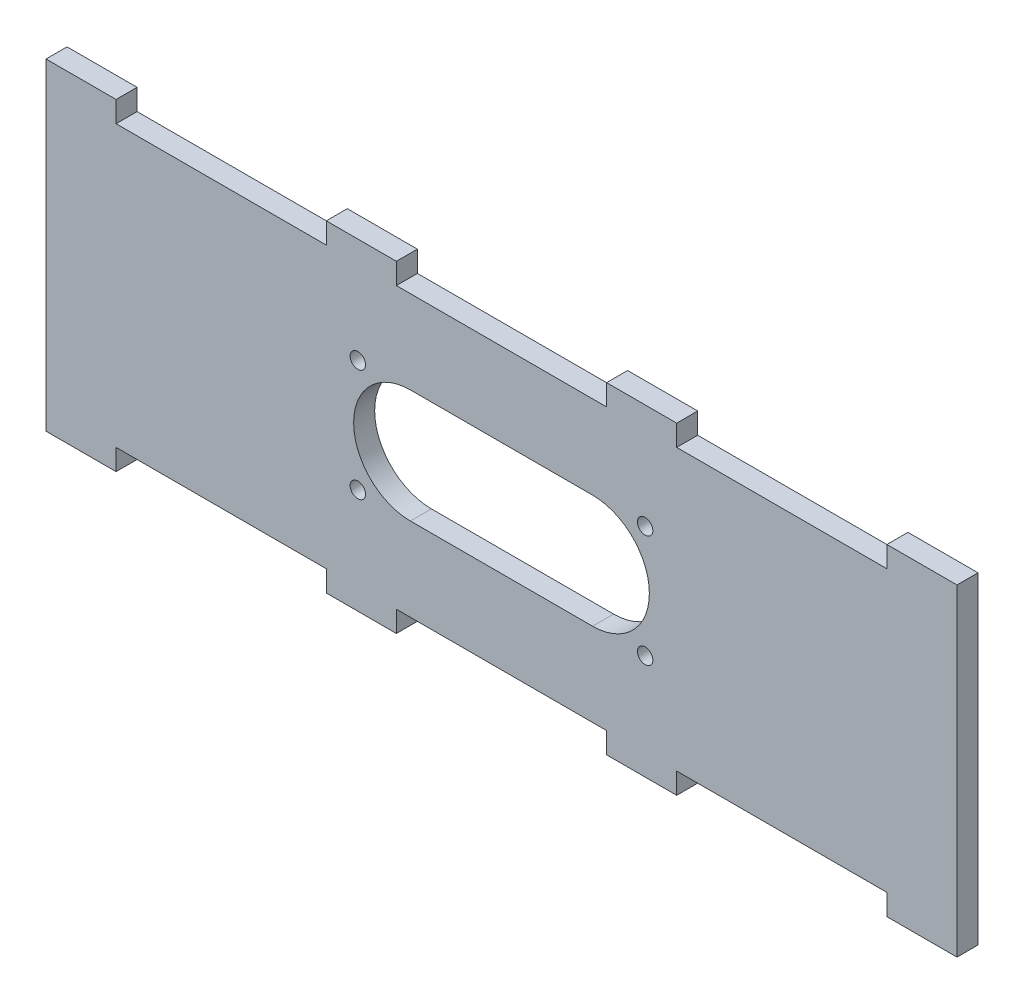
ISO-10303-21;
HEADER;
FILE_DESCRIPTION(('STEP AP214'),'2;1');
FILE_NAME('part.step','',(''),(''),'','','');
FILE_SCHEMA(('AUTOMOTIVE_DESIGN { 1 0 10303 214 1 1 1 1 }'));
ENDSEC;
DATA;
#1=APPLICATION_CONTEXT('core data for automotive mechanical design processes');
#2=APPLICATION_PROTOCOL_DEFINITION('international standard','automotive_design',2000,#1);
#3=PRODUCT_CONTEXT('',#1,'mechanical');
#4=PRODUCT('Part','Part','',(#3));
#5=PRODUCT_RELATED_PRODUCT_CATEGORY('part','',(#4));
#6=PRODUCT_DEFINITION_FORMATION('','',#4);
#7=PRODUCT_DEFINITION_CONTEXT('part definition',#1,'design');
#8=PRODUCT_DEFINITION('design','',#6,#7);
#9=PRODUCT_DEFINITION_SHAPE('','',#8);
#10=(LENGTH_UNIT() NAMED_UNIT(*) SI_UNIT(.MILLI.,.METRE.));
#11=(NAMED_UNIT(*) PLANE_ANGLE_UNIT() SI_UNIT($,.RADIAN.));
#12=(NAMED_UNIT(*) SI_UNIT($,.STERADIAN.) SOLID_ANGLE_UNIT());
#13=UNCERTAINTY_MEASURE_WITH_UNIT(LENGTH_MEASURE(1.E-05),#10,'distance_accuracy_value','');
#14=(GEOMETRIC_REPRESENTATION_CONTEXT(3) GLOBAL_UNCERTAINTY_ASSIGNED_CONTEXT((#13)) GLOBAL_UNIT_ASSIGNED_CONTEXT((#10,
#11,#12)) REPRESENTATION_CONTEXT('',''));
#15=CARTESIAN_POINT('',(0.,0.,0.));
#16=DIRECTION('',(0.,0.,1.));
#17=DIRECTION('',(1.,0.,0.));
#18=AXIS2_PLACEMENT_3D('',#15,#16,#17);
#19=CARTESIAN_POINT('',(-65.,0.,3.));
#20=DIRECTION('',(1.,0.,0.));
#21=DIRECTION('',(0.,0.,-1.));
#22=AXIS2_PLACEMENT_3D('',#19,#20,#21);
#23=PLANE('',#22);
#24=DIRECTION('',(0.,-1.,0.));
#25=VECTOR('',#24,1.);
#26=CARTESIAN_POINT('',(-65.,0.,0.));
#27=LINE('',#26,#25);
#28=CARTESIAN_POINT('',(-65.,23.,0.));
#29=VERTEX_POINT('',#28);
#30=CARTESIAN_POINT('',(-65.,-23.,0.));
#31=VERTEX_POINT('',#30);
#32=EDGE_CURVE('E305',#29,#31,#27,.T.);
#33=ORIENTED_EDGE('',*,*,#32,.T.);
#34=DIRECTION('',(0.,0.,-1.));
#35=VECTOR('',#34,1.);
#36=CARTESIAN_POINT('',(-65.,-23.,3.));
#37=LINE('',#36,#35);
#38=CARTESIAN_POINT('',(-65.,-23.,3.));
#39=VERTEX_POINT('',#38);
#40=EDGE_CURVE('E11',#39,#31,#37,.T.);
#41=ORIENTED_EDGE('',*,*,#40,.F.);
#42=DIRECTION('',(0.,-1.,0.));
#43=VECTOR('',#42,1.);
#44=CARTESIAN_POINT('',(-65.,0.,3.));
#45=LINE('',#44,#43);
#46=CARTESIAN_POINT('',(-65.,23.,3.));
#47=VERTEX_POINT('',#46);
#48=EDGE_CURVE('E309',#47,#39,#45,.T.);
#49=ORIENTED_EDGE('',*,*,#48,.F.);
#50=DIRECTION('',(0.,0.,-1.));
#51=VECTOR('',#50,1.);
#52=CARTESIAN_POINT('',(-65.,23.,3.));
#53=LINE('',#52,#51);
#54=EDGE_CURVE('E399',#47,#29,#53,.T.);
#55=ORIENTED_EDGE('',*,*,#54,.T.);
#56=EDGE_LOOP('',(#33,#41,#49,#55));
#57=FACE_BOUND('',#56,.T.);
#58=ADVANCED_FACE('F39',(#57),#23,.F.);
#59=CARTESIAN_POINT('',(0.,-23.,3.));
#60=DIRECTION('',(0.,1.,0.));
#61=DIRECTION('',(-1.,0.,0.));
#62=AXIS2_PLACEMENT_3D('',#59,#60,#61);
#63=PLANE('',#62);
#64=DIRECTION('',(1.,0.,0.));
#65=VECTOR('',#64,1.);
#66=CARTESIAN_POINT('',(0.,-23.,0.));
#67=LINE('',#66,#65);
#68=CARTESIAN_POINT('',(-55.,-23.,0.));
#69=VERTEX_POINT('',#68);
#70=EDGE_CURVE('E403',#31,#69,#67,.T.);
#71=ORIENTED_EDGE('',*,*,#70,.T.);
#72=DIRECTION('',(0.,0.,-1.));
#73=VECTOR('',#72,1.);
#74=CARTESIAN_POINT('',(-55.,-23.,3.));
#75=LINE('',#74,#73);
#76=CARTESIAN_POINT('',(-55.,-23.,3.));
#77=VERTEX_POINT('',#76);
#78=EDGE_CURVE('E47',#77,#69,#75,.T.);
#79=ORIENTED_EDGE('',*,*,#78,.F.);
#80=DIRECTION('',(1.,0.,0.));
#81=VECTOR('',#80,1.);
#82=CARTESIAN_POINT('',(0.,-23.,3.));
#83=LINE('',#82,#81);
#84=EDGE_CURVE('E313',#39,#77,#83,.T.);
#85=ORIENTED_EDGE('',*,*,#84,.F.);
#86=ORIENTED_EDGE('',*,*,#40,.T.);
#87=EDGE_LOOP('',(#71,#79,#85,#86));
#88=FACE_BOUND('',#87,.T.);
#89=ADVANCED_FACE('F583',(#88),#63,.F.);
#90=CARTESIAN_POINT('',(-55.,0.,3.));
#91=DIRECTION('',(1.,0.,0.));
#92=DIRECTION('',(0.,0.,-1.));
#93=AXIS2_PLACEMENT_3D('',#90,#91,#92);
#94=PLANE('',#93);
#95=DIRECTION('',(0.,-1.,0.));
#96=VECTOR('',#95,1.);
#97=CARTESIAN_POINT('',(-55.,0.,0.));
#98=LINE('',#97,#96);
#99=CARTESIAN_POINT('',(-55.,-20.,0.));
#100=VERTEX_POINT('',#99);
#101=EDGE_CURVE('E407',#100,#69,#98,.T.);
#102=ORIENTED_EDGE('',*,*,#101,.F.);
#103=DIRECTION('',(0.,0.,-1.));
#104=VECTOR('',#103,1.);
#105=CARTESIAN_POINT('',(-55.,-20.,3.));
#106=LINE('',#105,#104);
#107=CARTESIAN_POINT('',(-55.,-20.,3.));
#108=VERTEX_POINT('',#107);
#109=EDGE_CURVE('E574',#108,#100,#106,.T.);
#110=ORIENTED_EDGE('',*,*,#109,.F.);
#111=DIRECTION('',(0.,-1.,0.));
#112=VECTOR('',#111,1.);
#113=CARTESIAN_POINT('',(-55.,0.,3.));
#114=LINE('',#113,#112);
#115=EDGE_CURVE('E317',#108,#77,#114,.T.);
#116=ORIENTED_EDGE('',*,*,#115,.T.);
#117=ORIENTED_EDGE('',*,*,#78,.T.);
#118=EDGE_LOOP('',(#102,#110,#116,#117));
#119=FACE_BOUND('',#118,.T.);
#120=ADVANCED_FACE('F580',(#119),#94,.T.);
#121=CARTESIAN_POINT('',(0.,-20.,3.));
#122=DIRECTION('',(0.,1.,0.));
#123=DIRECTION('',(-1.,0.,0.));
#124=AXIS2_PLACEMENT_3D('',#121,#122,#123);
#125=PLANE('',#124);
#126=DIRECTION('',(1.,0.,0.));
#127=VECTOR('',#126,1.);
#128=CARTESIAN_POINT('',(0.,-20.,0.));
#129=LINE('',#128,#127);
#130=CARTESIAN_POINT('',(-25.,-20.,0.));
#131=VERTEX_POINT('',#130);
#132=EDGE_CURVE('E411',#100,#131,#129,.T.);
#133=ORIENTED_EDGE('',*,*,#132,.T.);
#134=DIRECTION('',(0.,0.,-1.));
#135=VECTOR('',#134,1.);
#136=CARTESIAN_POINT('',(-25.,-20.,3.));
#137=LINE('',#136,#135);
#138=CARTESIAN_POINT('',(-25.,-20.,3.));
#139=VERTEX_POINT('',#138);
#140=EDGE_CURVE('E570',#139,#131,#137,.T.);
#141=ORIENTED_EDGE('',*,*,#140,.F.);
#142=DIRECTION('',(1.,0.,0.));
#143=VECTOR('',#142,1.);
#144=CARTESIAN_POINT('',(0.,-20.,3.));
#145=LINE('',#144,#143);
#146=EDGE_CURVE('E321',#108,#139,#145,.T.);
#147=ORIENTED_EDGE('',*,*,#146,.F.);
#148=ORIENTED_EDGE('',*,*,#109,.T.);
#149=EDGE_LOOP('',(#133,#141,#147,#148));
#150=FACE_BOUND('',#149,.T.);
#151=ADVANCED_FACE('F592',(#150),#125,.F.);
#152=CARTESIAN_POINT('',(-24.9999999999993,8.38449680055438E-13,3.));
#153=DIRECTION('',(1.,0.,0.));
#154=DIRECTION('',(0.,1.,0.));
#155=AXIS2_PLACEMENT_3D('',#152,#153,#154);
#156=PLANE('',#155);
#157=DIRECTION('',(0.,-1.,0.));
#158=VECTOR('',#157,1.);
#159=CARTESIAN_POINT('',(-24.9999999999993,8.38449680055438E-13,0.));
#160=LINE('',#159,#158);
#161=CARTESIAN_POINT('',(-25.0000000000001,-23.,0.));
#162=VERTEX_POINT('',#161);
#163=EDGE_CURVE('E414',#131,#162,#160,.T.);
#164=ORIENTED_EDGE('',*,*,#163,.T.);
#165=DIRECTION('',(0.,0.,-1.));
#166=VECTOR('',#165,1.);
#167=CARTESIAN_POINT('',(-25.0000000000001,-23.,3.));
#168=LINE('',#167,#166);
#169=CARTESIAN_POINT('',(-25.0000000000001,-23.,3.));
#170=VERTEX_POINT('',#169);
#171=EDGE_CURVE('E566',#170,#162,#168,.T.);
#172=ORIENTED_EDGE('',*,*,#171,.F.);
#173=DIRECTION('',(0.,-1.,0.));
#174=VECTOR('',#173,1.);
#175=CARTESIAN_POINT('',(-24.9999999999993,8.38449680055438E-13,3.));
#176=LINE('',#175,#174);
#177=EDGE_CURVE('E324',#139,#170,#176,.T.);
#178=ORIENTED_EDGE('',*,*,#177,.F.);
#179=ORIENTED_EDGE('',*,*,#140,.T.);
#180=EDGE_LOOP('',(#164,#172,#178,#179));
#181=FACE_BOUND('',#180,.T.);
#182=ADVANCED_FACE('F596',(#181),#156,.F.);
#183=CARTESIAN_POINT('',(0.,-23.,3.));
#184=DIRECTION('',(0.,1.,0.));
#185=DIRECTION('',(0.,0.,1.));
#186=AXIS2_PLACEMENT_3D('',#183,#184,#185);
#187=PLANE('',#186);
#188=DIRECTION('',(1.,0.,0.));
#189=VECTOR('',#188,1.);
#190=CARTESIAN_POINT('',(0.,-23.,0.));
#191=LINE('',#190,#189);
#192=CARTESIAN_POINT('',(-15.0000000000001,-23.,0.));
#193=VERTEX_POINT('',#192);
#194=EDGE_CURVE('E419',#162,#193,#191,.T.);
#195=ORIENTED_EDGE('',*,*,#194,.T.);
#196=DIRECTION('',(0.,0.,-1.));
#197=VECTOR('',#196,1.);
#198=CARTESIAN_POINT('',(-15.0000000000001,-23.,3.));
#199=LINE('',#198,#197);
#200=CARTESIAN_POINT('',(-15.0000000000001,-23.,3.));
#201=VERTEX_POINT('',#200);
#202=EDGE_CURVE('E563',#201,#193,#199,.T.);
#203=ORIENTED_EDGE('',*,*,#202,.F.);
#204=DIRECTION('',(1.,0.,0.));
#205=VECTOR('',#204,1.);
#206=CARTESIAN_POINT('',(0.,-23.,3.));
#207=LINE('',#206,#205);
#208=EDGE_CURVE('E329',#170,#201,#207,.T.);
#209=ORIENTED_EDGE('',*,*,#208,.F.);
#210=ORIENTED_EDGE('',*,*,#171,.T.);
#211=EDGE_LOOP('',(#195,#203,#209,#210));
#212=FACE_BOUND('',#211,.T.);
#213=ADVANCED_FACE('F713',(#212),#187,.F.);
#214=CARTESIAN_POINT('',(-14.9999999999993,5.03069808033253E-13,3.));
#215=DIRECTION('',(1.,0.,0.));
#216=DIRECTION('',(0.,1.,0.));
#217=AXIS2_PLACEMENT_3D('',#214,#215,#216);
#218=PLANE('',#217);
#219=DIRECTION('',(0.,-1.,0.));
#220=VECTOR('',#219,1.);
#221=CARTESIAN_POINT('',(-14.9999999999993,5.03069808033253E-13,0.));
#222=LINE('',#221,#220);
#223=CARTESIAN_POINT('',(-15.,-20.,0.));
#224=VERTEX_POINT('',#223);
#225=EDGE_CURVE('E423',#224,#193,#222,.T.);
#226=ORIENTED_EDGE('',*,*,#225,.F.);
#227=DIRECTION('',(0.,0.,-1.));
#228=VECTOR('',#227,1.);
#229=CARTESIAN_POINT('',(-15.,-20.,3.));
#230=LINE('',#229,#228);
#231=CARTESIAN_POINT('',(-15.,-20.,3.));
#232=VERTEX_POINT('',#231);
#233=EDGE_CURVE('E560',#232,#224,#230,.T.);
#234=ORIENTED_EDGE('',*,*,#233,.F.);
#235=DIRECTION('',(0.,-1.,0.));
#236=VECTOR('',#235,1.);
#237=CARTESIAN_POINT('',(-14.9999999999993,5.03069808033253E-13,3.));
#238=LINE('',#237,#236);
#239=EDGE_CURVE('E332',#232,#201,#238,.T.);
#240=ORIENTED_EDGE('',*,*,#239,.T.);
#241=ORIENTED_EDGE('',*,*,#202,.T.);
#242=EDGE_LOOP('',(#226,#234,#240,#241));
#243=FACE_BOUND('',#242,.T.);
#244=ADVANCED_FACE('F716',(#243),#218,.T.);
#245=CARTESIAN_POINT('',(15.,-20.,0.));
#246=VERTEX_POINT('',#245);
#247=EDGE_CURVE('E416',#224,#246,#129,.T.);
#248=ORIENTED_EDGE('',*,*,#247,.T.);
#249=DIRECTION('',(0.,0.,-1.));
#250=VECTOR('',#249,1.);
#251=CARTESIAN_POINT('',(15.,-20.,3.));
#252=LINE('',#251,#250);
#253=CARTESIAN_POINT('',(15.,-20.,3.));
#254=VERTEX_POINT('',#253);
#255=EDGE_CURVE('E556',#254,#246,#252,.T.);
#256=ORIENTED_EDGE('',*,*,#255,.F.);
#257=EDGE_CURVE('E326',#232,#254,#145,.T.);
#258=ORIENTED_EDGE('',*,*,#257,.F.);
#259=ORIENTED_EDGE('',*,*,#233,.T.);
#260=EDGE_LOOP('',(#248,#256,#258,#259));
#261=FACE_BOUND('',#260,.T.);
#262=ADVANCED_FACE('F680',(#261),#125,.F.);
#263=CARTESIAN_POINT('',(14.9999999999994,4.77048955893603E-13,3.));
#264=DIRECTION('',(1.,0.,0.));
#265=DIRECTION('',(0.,1.,0.));
#266=AXIS2_PLACEMENT_3D('',#263,#264,#265);
#267=PLANE('',#266);
#268=DIRECTION('',(0.,-1.,0.));
#269=VECTOR('',#268,1.);
#270=CARTESIAN_POINT('',(14.9999999999994,4.77048955893603E-13,0.));
#271=LINE('',#270,#269);
#272=CARTESIAN_POINT('',(15.0000000000001,-23.,0.));
#273=VERTEX_POINT('',#272);
#274=EDGE_CURVE('E427',#246,#273,#271,.T.);
#275=ORIENTED_EDGE('',*,*,#274,.T.);
#276=DIRECTION('',(0.,0.,-1.));
#277=VECTOR('',#276,1.);
#278=CARTESIAN_POINT('',(15.0000000000001,-23.,3.));
#279=LINE('',#278,#277);
#280=CARTESIAN_POINT('',(15.0000000000001,-23.,3.));
#281=VERTEX_POINT('',#280);
#282=EDGE_CURVE('E553',#281,#273,#279,.T.);
#283=ORIENTED_EDGE('',*,*,#282,.F.);
#284=DIRECTION('',(0.,-1.,0.));
#285=VECTOR('',#284,1.);
#286=CARTESIAN_POINT('',(14.9999999999994,4.77048955893603E-13,3.));
#287=LINE('',#286,#285);
#288=EDGE_CURVE('E336',#254,#281,#287,.T.);
#289=ORIENTED_EDGE('',*,*,#288,.F.);
#290=ORIENTED_EDGE('',*,*,#255,.T.);
#291=EDGE_LOOP('',(#275,#283,#289,#290));
#292=FACE_BOUND('',#291,.T.);
#293=ADVANCED_FACE('F686',(#292),#267,.F.);
#294=CARTESIAN_POINT('',(0.,-23.,3.));
#295=DIRECTION('',(0.,-1.,0.));
#296=DIRECTION('',(1.,0.,0.));
#297=AXIS2_PLACEMENT_3D('',#294,#295,#296);
#298=PLANE('',#297);
#299=DIRECTION('',(-1.,0.,0.));
#300=VECTOR('',#299,1.);
#301=CARTESIAN_POINT('',(0.,-23.,0.));
#302=LINE('',#301,#300);
#303=CARTESIAN_POINT('',(25.0000000000001,-23.,0.));
#304=VERTEX_POINT('',#303);
#305=EDGE_CURVE('E431',#304,#273,#302,.T.);
#306=ORIENTED_EDGE('',*,*,#305,.F.);
#307=DIRECTION('',(0.,0.,-1.));
#308=VECTOR('',#307,1.);
#309=CARTESIAN_POINT('',(25.0000000000001,-23.,3.));
#310=LINE('',#309,#308);
#311=CARTESIAN_POINT('',(25.0000000000001,-23.,3.));
#312=VERTEX_POINT('',#311);
#313=EDGE_CURVE('E550',#312,#304,#310,.T.);
#314=ORIENTED_EDGE('',*,*,#313,.F.);
#315=DIRECTION('',(-1.,0.,0.));
#316=VECTOR('',#315,1.);
#317=CARTESIAN_POINT('',(0.,-23.,3.));
#318=LINE('',#317,#316);
#319=EDGE_CURVE('E339',#312,#281,#318,.T.);
#320=ORIENTED_EDGE('',*,*,#319,.T.);
#321=ORIENTED_EDGE('',*,*,#282,.T.);
#322=EDGE_LOOP('',(#306,#314,#320,#321));
#323=FACE_BOUND('',#322,.T.);
#324=ADVANCED_FACE('F690',(#323),#298,.T.);
#325=CARTESIAN_POINT('',(24.9999999999994,7.517135062566E-13,3.));
#326=DIRECTION('',(1.,0.,0.));
#327=DIRECTION('',(0.,1.,0.));
#328=AXIS2_PLACEMENT_3D('',#325,#326,#327);
#329=PLANE('',#328);
#330=DIRECTION('',(0.,-1.,0.));
#331=VECTOR('',#330,1.);
#332=CARTESIAN_POINT('',(24.9999999999994,7.517135062566E-13,0.));
#333=LINE('',#332,#331);
#334=CARTESIAN_POINT('',(25.,-20.,0.));
#335=VERTEX_POINT('',#334);
#336=EDGE_CURVE('E435',#335,#304,#333,.T.);
#337=ORIENTED_EDGE('',*,*,#336,.F.);
#338=DIRECTION('',(0.,0.,-1.));
#339=VECTOR('',#338,1.);
#340=CARTESIAN_POINT('',(25.,-20.,3.));
#341=LINE('',#340,#339);
#342=CARTESIAN_POINT('',(25.,-20.,3.));
#343=VERTEX_POINT('',#342);
#344=EDGE_CURVE('E547',#343,#335,#341,.T.);
#345=ORIENTED_EDGE('',*,*,#344,.F.);
#346=DIRECTION('',(0.,-1.,0.));
#347=VECTOR('',#346,1.);
#348=CARTESIAN_POINT('',(24.9999999999994,7.517135062566E-13,3.));
#349=LINE('',#348,#347);
#350=EDGE_CURVE('E343',#343,#312,#349,.T.);
#351=ORIENTED_EDGE('',*,*,#350,.T.);
#352=ORIENTED_EDGE('',*,*,#313,.T.);
#353=EDGE_LOOP('',(#337,#345,#351,#352));
#354=FACE_BOUND('',#353,.T.);
#355=ADVANCED_FACE('F693',(#354),#329,.T.);
#356=CARTESIAN_POINT('',(55.,-20.,0.));
#357=VERTEX_POINT('',#356);
#358=EDGE_CURVE('E415',#335,#357,#129,.T.);
#359=ORIENTED_EDGE('',*,*,#358,.T.);
#360=DIRECTION('',(0.,0.,-1.));
#361=VECTOR('',#360,1.);
#362=CARTESIAN_POINT('',(55.,-20.,3.));
#363=LINE('',#362,#361);
#364=CARTESIAN_POINT('',(55.,-20.,3.));
#365=VERTEX_POINT('',#364);
#366=EDGE_CURVE('E543',#365,#357,#363,.T.);
#367=ORIENTED_EDGE('',*,*,#366,.F.);
#368=EDGE_CURVE('E325',#343,#365,#145,.T.);
#369=ORIENTED_EDGE('',*,*,#368,.F.);
#370=ORIENTED_EDGE('',*,*,#344,.T.);
#371=EDGE_LOOP('',(#359,#367,#369,#370));
#372=FACE_BOUND('',#371,.T.);
#373=ADVANCED_FACE('F673',(#372),#125,.F.);
#374=CARTESIAN_POINT('',(55.0000000000002,-5.08852219619866E-13,3.));
#375=DIRECTION('',(1.,0.,0.));
#376=DIRECTION('',(0.,1.,0.));
#377=AXIS2_PLACEMENT_3D('',#374,#375,#376);
#378=PLANE('',#377);
#379=DIRECTION('',(0.,-1.,0.));
#380=VECTOR('',#379,1.);
#381=CARTESIAN_POINT('',(55.0000000000002,-5.08852219619866E-13,0.));
#382=LINE('',#381,#380);
#383=CARTESIAN_POINT('',(55.,-23.,0.));
#384=VERTEX_POINT('',#383);
#385=EDGE_CURVE('E439',#357,#384,#382,.T.);
#386=ORIENTED_EDGE('',*,*,#385,.T.);
#387=DIRECTION('',(0.,0.,-1.));
#388=VECTOR('',#387,1.);
#389=CARTESIAN_POINT('',(55.,-23.,3.));
#390=LINE('',#389,#388);
#391=CARTESIAN_POINT('',(55.,-23.,3.));
#392=VERTEX_POINT('',#391);
#393=EDGE_CURVE('E540',#392,#384,#390,.T.);
#394=ORIENTED_EDGE('',*,*,#393,.F.);
#395=DIRECTION('',(0.,-1.,0.));
#396=VECTOR('',#395,1.);
#397=CARTESIAN_POINT('',(55.0000000000002,-5.08852219619866E-13,3.));
#398=LINE('',#397,#396);
#399=EDGE_CURVE('E347',#365,#392,#398,.T.);
#400=ORIENTED_EDGE('',*,*,#399,.F.);
#401=ORIENTED_EDGE('',*,*,#366,.T.);
#402=EDGE_LOOP('',(#386,#394,#400,#401));
#403=FACE_BOUND('',#402,.T.);
#404=ADVANCED_FACE('F668',(#403),#378,.F.);
#405=CARTESIAN_POINT('',(0.,-23.,3.));
#406=DIRECTION('',(0.,-1.,0.));
#407=DIRECTION('',(0.,0.,-1.));
#408=AXIS2_PLACEMENT_3D('',#405,#406,#407);
#409=PLANE('',#408);
#410=DIRECTION('',(-1.,0.,0.));
#411=VECTOR('',#410,1.);
#412=CARTESIAN_POINT('',(0.,-23.,0.));
#413=LINE('',#412,#411);
#414=CARTESIAN_POINT('',(65.0000000000002,-23.,0.));
#415=VERTEX_POINT('',#414);
#416=EDGE_CURVE('E443',#415,#384,#413,.T.);
#417=ORIENTED_EDGE('',*,*,#416,.F.);
#418=DIRECTION('',(0.,0.,-1.));
#419=VECTOR('',#418,1.);
#420=CARTESIAN_POINT('',(65.0000000000002,-23.,3.));
#421=LINE('',#420,#419);
#422=CARTESIAN_POINT('',(65.0000000000002,-23.,3.));
#423=VERTEX_POINT('',#422);
#424=EDGE_CURVE('E537',#423,#415,#421,.T.);
#425=ORIENTED_EDGE('',*,*,#424,.F.);
#426=DIRECTION('',(-1.,0.,0.));
#427=VECTOR('',#426,1.);
#428=CARTESIAN_POINT('',(0.,-23.,3.));
#429=LINE('',#428,#427);
#430=EDGE_CURVE('E350',#423,#392,#429,.T.);
#431=ORIENTED_EDGE('',*,*,#430,.T.);
#432=ORIENTED_EDGE('',*,*,#393,.T.);
#433=EDGE_LOOP('',(#417,#425,#431,#432));
#434=FACE_BOUND('',#433,.T.);
#435=ADVANCED_FACE('F662',(#434),#409,.T.);
#436=CARTESIAN_POINT('',(65.,0.,3.));
#437=DIRECTION('',(1.,0.,0.));
#438=DIRECTION('',(0.,0.,-1.));
#439=AXIS2_PLACEMENT_3D('',#436,#437,#438);
#440=PLANE('',#439);
#441=DIRECTION('',(0.,-1.,0.));
#442=VECTOR('',#441,1.);
#443=CARTESIAN_POINT('',(65.,0.,0.));
#444=LINE('',#443,#442);
#445=CARTESIAN_POINT('',(65.0000000000002,23.,0.));
#446=VERTEX_POINT('',#445);
#447=EDGE_CURVE('E447',#446,#415,#444,.T.);
#448=ORIENTED_EDGE('',*,*,#447,.F.);
#449=DIRECTION('',(0.,0.,-1.));
#450=VECTOR('',#449,1.);
#451=CARTESIAN_POINT('',(65.0000000000002,23.,3.));
#452=LINE('',#451,#450);
#453=CARTESIAN_POINT('',(65.0000000000002,23.,3.));
#454=VERTEX_POINT('',#453);
#455=EDGE_CURVE('E534',#454,#446,#452,.T.);
#456=ORIENTED_EDGE('',*,*,#455,.F.);
#457=DIRECTION('',(0.,-1.,0.));
#458=VECTOR('',#457,1.);
#459=CARTESIAN_POINT('',(65.,0.,3.));
#460=LINE('',#459,#458);
#461=EDGE_CURVE('E354',#454,#423,#460,.T.);
#462=ORIENTED_EDGE('',*,*,#461,.T.);
#463=ORIENTED_EDGE('',*,*,#424,.T.);
#464=EDGE_LOOP('',(#448,#456,#462,#463));
#465=FACE_BOUND('',#464,.T.);
#466=ADVANCED_FACE('F656',(#465),#440,.T.);
#467=CARTESIAN_POINT('',(0.,23.,3.));
#468=DIRECTION('',(0.,-1.,0.));
#469=DIRECTION('',(0.,0.,-1.));
#470=AXIS2_PLACEMENT_3D('',#467,#468,#469);
#471=PLANE('',#470);
#472=DIRECTION('',(-1.,0.,0.));
#473=VECTOR('',#472,1.);
#474=CARTESIAN_POINT('',(0.,23.,0.));
#475=LINE('',#474,#473);
#476=CARTESIAN_POINT('',(55.,23.,0.));
#477=VERTEX_POINT('',#476);
#478=EDGE_CURVE('E451',#446,#477,#475,.T.);
#479=ORIENTED_EDGE('',*,*,#478,.T.);
#480=DIRECTION('',(0.,0.,-1.));
#481=VECTOR('',#480,1.);
#482=CARTESIAN_POINT('',(55.,23.,3.));
#483=LINE('',#482,#481);
#484=CARTESIAN_POINT('',(55.,23.,3.));
#485=VERTEX_POINT('',#484);
#486=EDGE_CURVE('E531',#485,#477,#483,.T.);
#487=ORIENTED_EDGE('',*,*,#486,.F.);
#488=DIRECTION('',(-1.,0.,0.));
#489=VECTOR('',#488,1.);
#490=CARTESIAN_POINT('',(0.,23.,3.));
#491=LINE('',#490,#489);
#492=EDGE_CURVE('E358',#454,#485,#491,.T.);
#493=ORIENTED_EDGE('',*,*,#492,.F.);
#494=ORIENTED_EDGE('',*,*,#455,.T.);
#495=EDGE_LOOP('',(#479,#487,#493,#494));
#496=FACE_BOUND('',#495,.T.);
#497=ADVANCED_FACE('F798',(#496),#471,.F.);
#498=CARTESIAN_POINT('',(55.0000000000002,5.08852219619866E-13,3.));
#499=DIRECTION('',(-1.,0.,0.));
#500=DIRECTION('',(0.,-1.,0.));
#501=AXIS2_PLACEMENT_3D('',#498,#499,#500);
#502=PLANE('',#501);
#503=DIRECTION('',(0.,1.,0.));
#504=VECTOR('',#503,1.);
#505=CARTESIAN_POINT('',(55.0000000000002,5.08852219619866E-13,0.));
#506=LINE('',#505,#504);
#507=CARTESIAN_POINT('',(55.,20.,0.));
#508=VERTEX_POINT('',#507);
#509=EDGE_CURVE('E455',#508,#477,#506,.T.);
#510=ORIENTED_EDGE('',*,*,#509,.F.);
#511=DIRECTION('',(0.,0.,-1.));
#512=VECTOR('',#511,1.);
#513=CARTESIAN_POINT('',(55.,20.,3.));
#514=LINE('',#513,#512);
#515=CARTESIAN_POINT('',(55.,20.,3.));
#516=VERTEX_POINT('',#515);
#517=EDGE_CURVE('E528',#516,#508,#514,.T.);
#518=ORIENTED_EDGE('',*,*,#517,.F.);
#519=DIRECTION('',(0.,1.,0.));
#520=VECTOR('',#519,1.);
#521=CARTESIAN_POINT('',(55.0000000000002,5.08852219619866E-13,3.));
#522=LINE('',#521,#520);
#523=EDGE_CURVE('E361',#516,#485,#522,.T.);
#524=ORIENTED_EDGE('',*,*,#523,.T.);
#525=ORIENTED_EDGE('',*,*,#486,.T.);
#526=EDGE_LOOP('',(#510,#518,#524,#525));
#527=FACE_BOUND('',#526,.T.);
#528=ADVANCED_FACE('F650',(#527),#502,.T.);
#529=CARTESIAN_POINT('',(0.,20.,3.));
#530=DIRECTION('',(0.,1.,0.));
#531=DIRECTION('',(-1.,0.,0.));
#532=AXIS2_PLACEMENT_3D('',#529,#530,#531);
#533=PLANE('',#532);
#534=DIRECTION('',(1.,0.,0.));
#535=VECTOR('',#534,1.);
#536=CARTESIAN_POINT('',(0.,20.,0.));
#537=LINE('',#536,#535);
#538=CARTESIAN_POINT('',(25.,20.,0.));
#539=VERTEX_POINT('',#538);
#540=EDGE_CURVE('E459',#539,#508,#537,.T.);
#541=ORIENTED_EDGE('',*,*,#540,.F.);
#542=DIRECTION('',(0.,0.,-1.));
#543=VECTOR('',#542,1.);
#544=CARTESIAN_POINT('',(25.,20.,3.));
#545=LINE('',#544,#543);
#546=CARTESIAN_POINT('',(25.,20.,3.));
#547=VERTEX_POINT('',#546);
#548=EDGE_CURVE('E525',#547,#539,#545,.T.);
#549=ORIENTED_EDGE('',*,*,#548,.F.);
#550=DIRECTION('',(1.,0.,0.));
#551=VECTOR('',#550,1.);
#552=CARTESIAN_POINT('',(0.,20.,3.));
#553=LINE('',#552,#551);
#554=EDGE_CURVE('E365',#547,#516,#553,.T.);
#555=ORIENTED_EDGE('',*,*,#554,.T.);
#556=ORIENTED_EDGE('',*,*,#517,.T.);
#557=EDGE_LOOP('',(#541,#549,#555,#556));
#558=FACE_BOUND('',#557,.T.);
#559=ADVANCED_FACE('F644',(#558),#533,.T.);
#560=CARTESIAN_POINT('',(24.9999999999994,-7.517135062566E-13,3.));
#561=DIRECTION('',(-1.,0.,0.));
#562=DIRECTION('',(0.,-1.,0.));
#563=AXIS2_PLACEMENT_3D('',#560,#561,#562);
#564=PLANE('',#563);
#565=DIRECTION('',(0.,1.,0.));
#566=VECTOR('',#565,1.);
#567=CARTESIAN_POINT('',(24.9999999999994,-7.517135062566E-13,0.));
#568=LINE('',#567,#566);
#569=CARTESIAN_POINT('',(25.0000000000001,23.,0.));
#570=VERTEX_POINT('',#569);
#571=EDGE_CURVE('E463',#539,#570,#568,.T.);
#572=ORIENTED_EDGE('',*,*,#571,.T.);
#573=DIRECTION('',(0.,0.,-1.));
#574=VECTOR('',#573,1.);
#575=CARTESIAN_POINT('',(25.0000000000001,23.,3.));
#576=LINE('',#575,#574);
#577=CARTESIAN_POINT('',(25.0000000000001,23.,3.));
#578=VERTEX_POINT('',#577);
#579=EDGE_CURVE('E521',#578,#570,#576,.T.);
#580=ORIENTED_EDGE('',*,*,#579,.F.);
#581=DIRECTION('',(0.,1.,0.));
#582=VECTOR('',#581,1.);
#583=CARTESIAN_POINT('',(24.9999999999994,-7.517135062566E-13,3.));
#584=LINE('',#583,#582);
#585=EDGE_CURVE('E369',#547,#578,#584,.T.);
#586=ORIENTED_EDGE('',*,*,#585,.F.);
#587=ORIENTED_EDGE('',*,*,#548,.T.);
#588=EDGE_LOOP('',(#572,#580,#586,#587));
#589=FACE_BOUND('',#588,.T.);
#590=ADVANCED_FACE('F825',(#589),#564,.F.);
#591=CARTESIAN_POINT('',(0.,23.,3.));
#592=DIRECTION('',(0.,-1.,0.));
#593=DIRECTION('',(1.,0.,0.));
#594=AXIS2_PLACEMENT_3D('',#591,#592,#593);
#595=PLANE('',#594);
#596=DIRECTION('',(-1.,0.,0.));
#597=VECTOR('',#596,1.);
#598=CARTESIAN_POINT('',(0.,23.,0.));
#599=LINE('',#598,#597);
#600=CARTESIAN_POINT('',(15.0000000000001,23.,0.));
#601=VERTEX_POINT('',#600);
#602=EDGE_CURVE('E468',#570,#601,#599,.T.);
#603=ORIENTED_EDGE('',*,*,#602,.T.);
#604=DIRECTION('',(0.,0.,-1.));
#605=VECTOR('',#604,1.);
#606=CARTESIAN_POINT('',(15.0000000000001,23.,3.));
#607=LINE('',#606,#605);
#608=CARTESIAN_POINT('',(15.0000000000001,23.,3.));
#609=VERTEX_POINT('',#608);
#610=EDGE_CURVE('E518',#609,#601,#607,.T.);
#611=ORIENTED_EDGE('',*,*,#610,.F.);
#612=DIRECTION('',(-1.,0.,0.));
#613=VECTOR('',#612,1.);
#614=CARTESIAN_POINT('',(0.,23.,3.));
#615=LINE('',#614,#613);
#616=EDGE_CURVE('E374',#578,#609,#615,.T.);
#617=ORIENTED_EDGE('',*,*,#616,.F.);
#618=ORIENTED_EDGE('',*,*,#579,.T.);
#619=EDGE_LOOP('',(#603,#611,#617,#618));
#620=FACE_BOUND('',#619,.T.);
#621=ADVANCED_FACE('F638',(#620),#595,.F.);
#622=CARTESIAN_POINT('',(14.9999999999994,-4.77048955893603E-13,3.));
#623=DIRECTION('',(-1.,0.,0.));
#624=DIRECTION('',(0.,-1.,0.));
#625=AXIS2_PLACEMENT_3D('',#622,#623,#624);
#626=PLANE('',#625);
#627=DIRECTION('',(0.,1.,0.));
#628=VECTOR('',#627,1.);
#629=CARTESIAN_POINT('',(14.9999999999994,-4.77048955893603E-13,0.));
#630=LINE('',#629,#628);
#631=CARTESIAN_POINT('',(15.,20.,0.));
#632=VERTEX_POINT('',#631);
#633=EDGE_CURVE('E472',#632,#601,#630,.T.);
#634=ORIENTED_EDGE('',*,*,#633,.F.);
#635=DIRECTION('',(0.,0.,-1.));
#636=VECTOR('',#635,1.);
#637=CARTESIAN_POINT('',(15.,20.,3.));
#638=LINE('',#637,#636);
#639=CARTESIAN_POINT('',(15.,20.,3.));
#640=VERTEX_POINT('',#639);
#641=EDGE_CURVE('E515',#640,#632,#638,.T.);
#642=ORIENTED_EDGE('',*,*,#641,.F.);
#643=DIRECTION('',(0.,1.,0.));
#644=VECTOR('',#643,1.);
#645=CARTESIAN_POINT('',(14.9999999999994,-4.77048955893603E-13,3.));
#646=LINE('',#645,#644);
#647=EDGE_CURVE('E377',#640,#609,#646,.T.);
#648=ORIENTED_EDGE('',*,*,#647,.T.);
#649=ORIENTED_EDGE('',*,*,#610,.T.);
#650=EDGE_LOOP('',(#634,#642,#648,#649));
#651=FACE_BOUND('',#650,.T.);
#652=ADVANCED_FACE('F634',(#651),#626,.T.);
#653=CARTESIAN_POINT('',(-15.,20.,0.));
#654=VERTEX_POINT('',#653);
#655=EDGE_CURVE('E465',#654,#632,#537,.T.);
#656=ORIENTED_EDGE('',*,*,#655,.F.);
#657=DIRECTION('',(0.,0.,-1.));
#658=VECTOR('',#657,1.);
#659=CARTESIAN_POINT('',(-15.,20.,3.));
#660=LINE('',#659,#658);
#661=CARTESIAN_POINT('',(-15.,20.,3.));
#662=VERTEX_POINT('',#661);
#663=EDGE_CURVE('E512',#662,#654,#660,.T.);
#664=ORIENTED_EDGE('',*,*,#663,.F.);
#665=EDGE_CURVE('E371',#662,#640,#553,.T.);
#666=ORIENTED_EDGE('',*,*,#665,.T.);
#667=ORIENTED_EDGE('',*,*,#641,.T.);
#668=EDGE_LOOP('',(#656,#664,#666,#667));
#669=FACE_BOUND('',#668,.T.);
#670=ADVANCED_FACE('F628',(#669),#533,.T.);
#671=CARTESIAN_POINT('',(-14.9999999999993,-5.03069808033253E-13,3.));
#672=DIRECTION('',(-1.,0.,0.));
#673=DIRECTION('',(0.,-1.,0.));
#674=AXIS2_PLACEMENT_3D('',#671,#672,#673);
#675=PLANE('',#674);
#676=DIRECTION('',(0.,1.,0.));
#677=VECTOR('',#676,1.);
#678=CARTESIAN_POINT('',(-14.9999999999993,-5.03069808033253E-13,0.));
#679=LINE('',#678,#677);
#680=CARTESIAN_POINT('',(-15.0000000000001,23.,0.));
#681=VERTEX_POINT('',#680);
#682=EDGE_CURVE('E476',#654,#681,#679,.T.);
#683=ORIENTED_EDGE('',*,*,#682,.T.);
#684=DIRECTION('',(0.,0.,-1.));
#685=VECTOR('',#684,1.);
#686=CARTESIAN_POINT('',(-15.0000000000001,23.,3.));
#687=LINE('',#686,#685);
#688=CARTESIAN_POINT('',(-15.0000000000001,23.,3.));
#689=VERTEX_POINT('',#688);
#690=EDGE_CURVE('E509',#689,#681,#687,.T.);
#691=ORIENTED_EDGE('',*,*,#690,.F.);
#692=DIRECTION('',(0.,1.,0.));
#693=VECTOR('',#692,1.);
#694=CARTESIAN_POINT('',(-14.9999999999993,-5.03069808033253E-13,3.));
#695=LINE('',#694,#693);
#696=EDGE_CURVE('E381',#662,#689,#695,.T.);
#697=ORIENTED_EDGE('',*,*,#696,.F.);
#698=ORIENTED_EDGE('',*,*,#663,.T.);
#699=EDGE_LOOP('',(#683,#691,#697,#698));
#700=FACE_BOUND('',#699,.T.);
#701=ADVANCED_FACE('F860',(#700),#675,.F.);
#702=CARTESIAN_POINT('',(0.,23.,3.));
#703=DIRECTION('',(0.,1.,0.));
#704=DIRECTION('',(0.,0.,1.));
#705=AXIS2_PLACEMENT_3D('',#702,#703,#704);
#706=PLANE('',#705);
#707=DIRECTION('',(1.,0.,0.));
#708=VECTOR('',#707,1.);
#709=CARTESIAN_POINT('',(0.,23.,0.));
#710=LINE('',#709,#708);
#711=CARTESIAN_POINT('',(-25.0000000000001,23.,0.));
#712=VERTEX_POINT('',#711);
#713=EDGE_CURVE('E480',#712,#681,#710,.T.);
#714=ORIENTED_EDGE('',*,*,#713,.F.);
#715=DIRECTION('',(0.,0.,-1.));
#716=VECTOR('',#715,1.);
#717=CARTESIAN_POINT('',(-25.0000000000001,23.,3.));
#718=LINE('',#717,#716);
#719=CARTESIAN_POINT('',(-25.0000000000001,23.,3.));
#720=VERTEX_POINT('',#719);
#721=EDGE_CURVE('E506',#720,#712,#718,.T.);
#722=ORIENTED_EDGE('',*,*,#721,.F.);
#723=DIRECTION('',(1.,0.,0.));
#724=VECTOR('',#723,1.);
#725=CARTESIAN_POINT('',(0.,23.,3.));
#726=LINE('',#725,#724);
#727=EDGE_CURVE('E384',#720,#689,#726,.T.);
#728=ORIENTED_EDGE('',*,*,#727,.T.);
#729=ORIENTED_EDGE('',*,*,#690,.T.);
#730=EDGE_LOOP('',(#714,#722,#728,#729));
#731=FACE_BOUND('',#730,.T.);
#732=ADVANCED_FACE('F869',(#731),#706,.T.);
#733=CARTESIAN_POINT('',(-24.9999999999993,-8.38449680055438E-13,3.));
#734=DIRECTION('',(-1.,0.,0.));
#735=DIRECTION('',(0.,-1.,0.));
#736=AXIS2_PLACEMENT_3D('',#733,#734,#735);
#737=PLANE('',#736);
#738=DIRECTION('',(0.,1.,0.));
#739=VECTOR('',#738,1.);
#740=CARTESIAN_POINT('',(-24.9999999999993,-8.38449680055438E-13,0.));
#741=LINE('',#740,#739);
#742=CARTESIAN_POINT('',(-25.,20.,0.));
#743=VERTEX_POINT('',#742);
#744=EDGE_CURVE('E484',#743,#712,#741,.T.);
#745=ORIENTED_EDGE('',*,*,#744,.F.);
#746=DIRECTION('',(0.,0.,-1.));
#747=VECTOR('',#746,1.);
#748=CARTESIAN_POINT('',(-25.,20.,3.));
#749=LINE('',#748,#747);
#750=CARTESIAN_POINT('',(-25.,20.,3.));
#751=VERTEX_POINT('',#750);
#752=EDGE_CURVE('E503',#751,#743,#749,.T.);
#753=ORIENTED_EDGE('',*,*,#752,.F.);
#754=DIRECTION('',(0.,1.,0.));
#755=VECTOR('',#754,1.);
#756=CARTESIAN_POINT('',(-24.9999999999993,-8.38449680055438E-13,3.));
#757=LINE('',#756,#755);
#758=EDGE_CURVE('E388',#751,#720,#757,.T.);
#759=ORIENTED_EDGE('',*,*,#758,.T.);
#760=ORIENTED_EDGE('',*,*,#721,.T.);
#761=EDGE_LOOP('',(#745,#753,#759,#760));
#762=FACE_BOUND('',#761,.T.);
#763=ADVANCED_FACE('F879',(#762),#737,.T.);
#764=CARTESIAN_POINT('',(-55.,20.,0.));
#765=VERTEX_POINT('',#764);
#766=EDGE_CURVE('E464',#765,#743,#537,.T.);
#767=ORIENTED_EDGE('',*,*,#766,.F.);
#768=DIRECTION('',(0.,0.,-1.));
#769=VECTOR('',#768,1.);
#770=CARTESIAN_POINT('',(-55.,20.,3.));
#771=LINE('',#770,#769);
#772=CARTESIAN_POINT('',(-55.,20.,3.));
#773=VERTEX_POINT('',#772);
#774=EDGE_CURVE('E500',#773,#765,#771,.T.);
#775=ORIENTED_EDGE('',*,*,#774,.F.);
#776=EDGE_CURVE('E370',#773,#751,#553,.T.);
#777=ORIENTED_EDGE('',*,*,#776,.T.);
#778=ORIENTED_EDGE('',*,*,#752,.T.);
#779=EDGE_LOOP('',(#767,#775,#777,#778));
#780=FACE_BOUND('',#779,.T.);
#781=ADVANCED_FACE('F617',(#780),#533,.T.);
#782=CARTESIAN_POINT('',(-55.,0.,3.));
#783=DIRECTION('',(-1.,0.,0.));
#784=DIRECTION('',(0.,0.,1.));
#785=AXIS2_PLACEMENT_3D('',#782,#783,#784);
#786=PLANE('',#785);
#787=DIRECTION('',(0.,1.,0.));
#788=VECTOR('',#787,1.);
#789=CARTESIAN_POINT('',(-55.,0.,0.));
#790=LINE('',#789,#788);
#791=CARTESIAN_POINT('',(-55.,23.,0.));
#792=VERTEX_POINT('',#791);
#793=EDGE_CURVE('E488',#765,#792,#790,.T.);
#794=ORIENTED_EDGE('',*,*,#793,.T.);
#795=DIRECTION('',(0.,0.,-1.));
#796=VECTOR('',#795,1.);
#797=CARTESIAN_POINT('',(-55.,23.,3.));
#798=LINE('',#797,#796);
#799=CARTESIAN_POINT('',(-55.,23.,3.));
#800=VERTEX_POINT('',#799);
#801=EDGE_CURVE('E497',#800,#792,#798,.T.);
#802=ORIENTED_EDGE('',*,*,#801,.F.);
#803=DIRECTION('',(0.,1.,0.));
#804=VECTOR('',#803,1.);
#805=CARTESIAN_POINT('',(-55.,0.,3.));
#806=LINE('',#805,#804);
#807=EDGE_CURVE('E392',#773,#800,#806,.T.);
#808=ORIENTED_EDGE('',*,*,#807,.F.);
#809=ORIENTED_EDGE('',*,*,#774,.T.);
#810=EDGE_LOOP('',(#794,#802,#808,#809));
#811=FACE_BOUND('',#810,.T.);
#812=ADVANCED_FACE('F613',(#811),#786,.F.);
#813=CARTESIAN_POINT('',(0.,23.,3.));
#814=DIRECTION('',(0.,1.,0.));
#815=DIRECTION('',(-1.,0.,0.));
#816=AXIS2_PLACEMENT_3D('',#813,#814,#815);
#817=PLANE('',#816);
#818=DIRECTION('',(1.,0.,0.));
#819=VECTOR('',#818,1.);
#820=CARTESIAN_POINT('',(0.,23.,0.));
#821=LINE('',#820,#819);
#822=EDGE_CURVE('E314',#29,#792,#821,.T.);
#823=ORIENTED_EDGE('',*,*,#822,.F.);
#824=ORIENTED_EDGE('',*,*,#54,.F.);
#825=DIRECTION('',(1.,0.,0.));
#826=VECTOR('',#825,1.);
#827=CARTESIAN_POINT('',(0.,23.,3.));
#828=LINE('',#827,#826);
#829=EDGE_CURVE('E395',#47,#800,#828,.T.);
#830=ORIENTED_EDGE('',*,*,#829,.T.);
#831=ORIENTED_EDGE('',*,*,#801,.T.);
#832=EDGE_LOOP('',(#823,#824,#830,#831));
#833=FACE_BOUND('',#832,.T.);
#834=ADVANCED_FACE('F609',(#833),#817,.T.);
#835=CARTESIAN_POINT('',(0.,0.,3.));
#836=DIRECTION('',(0.,0.,1.));
#837=DIRECTION('',(1.,0.,0.));
#838=AXIS2_PLACEMENT_3D('',#835,#836,#837);
#839=PLANE('',#838);
#840=CARTESIAN_POINT('',(-20.5,-8.,3.));
#841=DIRECTION('',(0.,0.,1.));
#842=DIRECTION('',(1.,0.,0.));
#843=AXIS2_PLACEMENT_3D('',#840,#841,#842);
#844=CIRCLE('',#843,1.1);
#845=CARTESIAN_POINT('',(-19.4,-8.,3.));
#846=VERTEX_POINT('',#845);
#847=EDGE_CURVE('E276',#846,#846,#844,.T.);
#848=ORIENTED_EDGE('',*,*,#847,.F.);
#849=EDGE_LOOP('',(#848));
#850=FACE_BOUND('',#849,.T.);
#851=CARTESIAN_POINT('',(-13.,0.,3.));
#852=DIRECTION('',(0.,0.,1.));
#853=DIRECTION('',(1.,0.,0.));
#854=AXIS2_PLACEMENT_3D('',#851,#852,#853);
#855=CIRCLE('',#854,8.1);
#856=CARTESIAN_POINT('',(-13.,8.1,3.));
#857=VERTEX_POINT('',#856);
#858=CARTESIAN_POINT('',(-13.,-8.1,3.));
#859=VERTEX_POINT('',#858);
#860=EDGE_CURVE('E54',#857,#859,#855,.T.);
#861=ORIENTED_EDGE('',*,*,#860,.F.);
#862=DIRECTION('',(-1.,0.,0.));
#863=VECTOR('',#862,1.);
#864=CARTESIAN_POINT('',(-13.,8.1,3.));
#865=LINE('',#864,#863);
#866=CARTESIAN_POINT('',(13.,8.1,3.));
#867=VERTEX_POINT('',#866);
#868=EDGE_CURVE('E269',#867,#857,#865,.T.);
#869=ORIENTED_EDGE('',*,*,#868,.F.);
#870=CARTESIAN_POINT('',(13.,0.,3.));
#871=DIRECTION('',(0.,0.,1.));
#872=DIRECTION('',(1.,0.,0.));
#873=AXIS2_PLACEMENT_3D('',#870,#871,#872);
#874=CIRCLE('',#873,8.1);
#875=CARTESIAN_POINT('',(13.,-8.1,3.));
#876=VERTEX_POINT('',#875);
#877=EDGE_CURVE('E273',#876,#867,#874,.T.);
#878=ORIENTED_EDGE('',*,*,#877,.F.);
#879=DIRECTION('',(1.,0.,0.));
#880=VECTOR('',#879,1.);
#881=CARTESIAN_POINT('',(-13.,-8.1,3.));
#882=LINE('',#881,#880);
#883=EDGE_CURVE('E285',#859,#876,#882,.T.);
#884=ORIENTED_EDGE('',*,*,#883,.F.);
#885=EDGE_LOOP('',(#861,#869,#878,#884));
#886=FACE_BOUND('',#885,.T.);
#887=CARTESIAN_POINT('',(20.5,8.,3.));
#888=DIRECTION('',(0.,0.,1.));
#889=DIRECTION('',(1.,0.,0.));
#890=AXIS2_PLACEMENT_3D('',#887,#888,#889);
#891=CIRCLE('',#890,1.1);
#892=CARTESIAN_POINT('',(21.6,8.,3.));
#893=VERTEX_POINT('',#892);
#894=EDGE_CURVE('E1025',#893,#893,#891,.T.);
#895=ORIENTED_EDGE('',*,*,#894,.F.);
#896=EDGE_LOOP('',(#895));
#897=FACE_BOUND('',#896,.T.);
#898=CARTESIAN_POINT('',(20.5,-8.,3.));
#899=DIRECTION('',(0.,0.,1.));
#900=DIRECTION('',(1.,0.,0.));
#901=AXIS2_PLACEMENT_3D('',#898,#899,#900);
#902=CIRCLE('',#901,1.1);
#903=CARTESIAN_POINT('',(21.6,-8.,3.));
#904=VERTEX_POINT('',#903);
#905=EDGE_CURVE('E1036',#904,#904,#902,.T.);
#906=ORIENTED_EDGE('',*,*,#905,.F.);
#907=EDGE_LOOP('',(#906));
#908=FACE_BOUND('',#907,.T.);
#909=CARTESIAN_POINT('',(-20.5,8.,3.));
#910=DIRECTION('',(0.,0.,1.));
#911=DIRECTION('',(1.,0.,0.));
#912=AXIS2_PLACEMENT_3D('',#909,#910,#911);
#913=CIRCLE('',#912,1.1);
#914=CARTESIAN_POINT('',(-19.4,8.,3.));
#915=VERTEX_POINT('',#914);
#916=EDGE_CURVE('E295',#915,#915,#913,.T.);
#917=ORIENTED_EDGE('',*,*,#916,.F.);
#918=EDGE_LOOP('',(#917));
#919=FACE_BOUND('',#918,.T.);
#920=ORIENTED_EDGE('',*,*,#48,.T.);
#921=ORIENTED_EDGE('',*,*,#84,.T.);
#922=ORIENTED_EDGE('',*,*,#115,.F.);
#923=ORIENTED_EDGE('',*,*,#146,.T.);
#924=ORIENTED_EDGE('',*,*,#177,.T.);
#925=ORIENTED_EDGE('',*,*,#208,.T.);
#926=ORIENTED_EDGE('',*,*,#239,.F.);
#927=ORIENTED_EDGE('',*,*,#257,.T.);
#928=ORIENTED_EDGE('',*,*,#288,.T.);
#929=ORIENTED_EDGE('',*,*,#319,.F.);
#930=ORIENTED_EDGE('',*,*,#350,.F.);
#931=ORIENTED_EDGE('',*,*,#368,.T.);
#932=ORIENTED_EDGE('',*,*,#399,.T.);
#933=ORIENTED_EDGE('',*,*,#430,.F.);
#934=ORIENTED_EDGE('',*,*,#461,.F.);
#935=ORIENTED_EDGE('',*,*,#492,.T.);
#936=ORIENTED_EDGE('',*,*,#523,.F.);
#937=ORIENTED_EDGE('',*,*,#554,.F.);
#938=ORIENTED_EDGE('',*,*,#585,.T.);
#939=ORIENTED_EDGE('',*,*,#616,.T.);
#940=ORIENTED_EDGE('',*,*,#647,.F.);
#941=ORIENTED_EDGE('',*,*,#665,.F.);
#942=ORIENTED_EDGE('',*,*,#696,.T.);
#943=ORIENTED_EDGE('',*,*,#727,.F.);
#944=ORIENTED_EDGE('',*,*,#758,.F.);
#945=ORIENTED_EDGE('',*,*,#776,.F.);
#946=ORIENTED_EDGE('',*,*,#807,.T.);
#947=ORIENTED_EDGE('',*,*,#829,.F.);
#948=EDGE_LOOP('',(#920,#921,#922,#923,#924,#925,#926,#927,#928,#929,#930,#931,#932,#933,#934,
#935,#936,#937,#938,#939,#940,#941,#942,#943,#944,#945,#946,#947));
#949=FACE_BOUND('',#948,.T.);
#950=ADVANCED_FACE('F600',(#850,#886,#897,#908,#919,#949),#839,.T.);
#951=CARTESIAN_POINT('',(0.,0.,0.));
#952=DIRECTION('',(0.,0.,1.));
#953=DIRECTION('',(1.,0.,0.));
#954=AXIS2_PLACEMENT_3D('',#951,#952,#953);
#955=PLANE('',#954);
#956=CARTESIAN_POINT('',(-20.5,-8.,0.));
#957=DIRECTION('',(0.,0.,1.));
#958=DIRECTION('',(1.,0.,0.));
#959=AXIS2_PLACEMENT_3D('',#956,#957,#958);
#960=CIRCLE('',#959,1.1);
#961=CARTESIAN_POINT('',(-19.4,-8.,0.));
#962=VERTEX_POINT('',#961);
#963=EDGE_CURVE('E286',#962,#962,#960,.T.);
#964=ORIENTED_EDGE('',*,*,#963,.T.);
#965=EDGE_LOOP('',(#964));
#966=FACE_BOUND('',#965,.T.);
#967=DIRECTION('',(-1.,0.,0.));
#968=VECTOR('',#967,1.);
#969=CARTESIAN_POINT('',(-13.,8.1,0.));
#970=LINE('',#969,#968);
#971=CARTESIAN_POINT('',(13.,8.1,0.));
#972=VERTEX_POINT('',#971);
#973=CARTESIAN_POINT('',(-13.,8.1,0.));
#974=VERTEX_POINT('',#973);
#975=EDGE_CURVE('E257',#972,#974,#970,.T.);
#976=ORIENTED_EDGE('',*,*,#975,.T.);
#977=CARTESIAN_POINT('',(-13.,0.,0.));
#978=DIRECTION('',(0.,0.,1.));
#979=DIRECTION('',(1.,0.,0.));
#980=AXIS2_PLACEMENT_3D('',#977,#978,#979);
#981=CIRCLE('',#980,8.1);
#982=CARTESIAN_POINT('',(-13.,-8.1,0.));
#983=VERTEX_POINT('',#982);
#984=EDGE_CURVE('E250',#974,#983,#981,.T.);
#985=ORIENTED_EDGE('',*,*,#984,.T.);
#986=DIRECTION('',(1.,0.,0.));
#987=VECTOR('',#986,1.);
#988=CARTESIAN_POINT('',(-13.,-8.1,0.));
#989=LINE('',#988,#987);
#990=CARTESIAN_POINT('',(13.,-8.1,0.));
#991=VERTEX_POINT('',#990);
#992=EDGE_CURVE('E260',#983,#991,#989,.T.);
#993=ORIENTED_EDGE('',*,*,#992,.T.);
#994=CARTESIAN_POINT('',(13.,0.,0.));
#995=DIRECTION('',(0.,0.,1.));
#996=DIRECTION('',(1.,0.,0.));
#997=AXIS2_PLACEMENT_3D('',#994,#995,#996);
#998=CIRCLE('',#997,8.1);
#999=EDGE_CURVE('E62',#991,#972,#998,.T.);
#1000=ORIENTED_EDGE('',*,*,#999,.T.);
#1001=EDGE_LOOP('',(#976,#985,#993,#1000));
#1002=FACE_BOUND('',#1001,.T.);
#1003=CARTESIAN_POINT('',(20.5,8.,0.));
#1004=DIRECTION('',(0.,0.,1.));
#1005=DIRECTION('',(1.,0.,0.));
#1006=AXIS2_PLACEMENT_3D('',#1003,#1004,#1005);
#1007=CIRCLE('',#1006,1.1);
#1008=CARTESIAN_POINT('',(21.6,8.,0.));
#1009=VERTEX_POINT('',#1008);
#1010=EDGE_CURVE('E1021',#1009,#1009,#1007,.T.);
#1011=ORIENTED_EDGE('',*,*,#1010,.T.);
#1012=EDGE_LOOP('',(#1011));
#1013=FACE_BOUND('',#1012,.T.);
#1014=CARTESIAN_POINT('',(20.5,-8.,0.));
#1015=DIRECTION('',(0.,0.,1.));
#1016=DIRECTION('',(1.,0.,0.));
#1017=AXIS2_PLACEMENT_3D('',#1014,#1015,#1016);
#1018=CIRCLE('',#1017,1.1);
#1019=CARTESIAN_POINT('',(21.6,-8.,0.));
#1020=VERTEX_POINT('',#1019);
#1021=EDGE_CURVE('E1030',#1020,#1020,#1018,.T.);
#1022=ORIENTED_EDGE('',*,*,#1021,.T.);
#1023=EDGE_LOOP('',(#1022));
#1024=FACE_BOUND('',#1023,.T.);
#1025=CARTESIAN_POINT('',(-20.5,8.,0.));
#1026=DIRECTION('',(0.,0.,1.));
#1027=DIRECTION('',(1.,0.,0.));
#1028=AXIS2_PLACEMENT_3D('',#1025,#1026,#1027);
#1029=CIRCLE('',#1028,1.1);
#1030=CARTESIAN_POINT('',(-19.4,8.,0.));
#1031=VERTEX_POINT('',#1030);
#1032=EDGE_CURVE('E301',#1031,#1031,#1029,.T.);
#1033=ORIENTED_EDGE('',*,*,#1032,.T.);
#1034=EDGE_LOOP('',(#1033));
#1035=FACE_BOUND('',#1034,.T.);
#1036=ORIENTED_EDGE('',*,*,#32,.F.);
#1037=ORIENTED_EDGE('',*,*,#822,.T.);
#1038=ORIENTED_EDGE('',*,*,#793,.F.);
#1039=ORIENTED_EDGE('',*,*,#766,.T.);
#1040=ORIENTED_EDGE('',*,*,#744,.T.);
#1041=ORIENTED_EDGE('',*,*,#713,.T.);
#1042=ORIENTED_EDGE('',*,*,#682,.F.);
#1043=ORIENTED_EDGE('',*,*,#655,.T.);
#1044=ORIENTED_EDGE('',*,*,#633,.T.);
#1045=ORIENTED_EDGE('',*,*,#602,.F.);
#1046=ORIENTED_EDGE('',*,*,#571,.F.);
#1047=ORIENTED_EDGE('',*,*,#540,.T.);
#1048=ORIENTED_EDGE('',*,*,#509,.T.);
#1049=ORIENTED_EDGE('',*,*,#478,.F.);
#1050=ORIENTED_EDGE('',*,*,#447,.T.);
#1051=ORIENTED_EDGE('',*,*,#416,.T.);
#1052=ORIENTED_EDGE('',*,*,#385,.F.);
#1053=ORIENTED_EDGE('',*,*,#358,.F.);
#1054=ORIENTED_EDGE('',*,*,#336,.T.);
#1055=ORIENTED_EDGE('',*,*,#305,.T.);
#1056=ORIENTED_EDGE('',*,*,#274,.F.);
#1057=ORIENTED_EDGE('',*,*,#247,.F.);
#1058=ORIENTED_EDGE('',*,*,#225,.T.);
#1059=ORIENTED_EDGE('',*,*,#194,.F.);
#1060=ORIENTED_EDGE('',*,*,#163,.F.);
#1061=ORIENTED_EDGE('',*,*,#132,.F.);
#1062=ORIENTED_EDGE('',*,*,#101,.T.);
#1063=ORIENTED_EDGE('',*,*,#70,.F.);
#1064=EDGE_LOOP('',(#1036,#1037,#1038,#1039,#1040,#1041,#1042,#1043,#1044,#1045,#1046,#1047,
#1048,#1049,#1050,#1051,#1052,#1053,#1054,#1055,#1056,#1057,#1058,#1059,#1060,#1061,#1062,#1063));
#1065=FACE_BOUND('',#1064,.T.);
#1066=ADVANCED_FACE('F265',(#966,#1002,#1013,#1024,#1035,#1065),#955,.F.);
#1067=CARTESIAN_POINT('',(-20.5,8.,0.));
#1068=DIRECTION('',(0.,0.,1.));
#1069=DIRECTION('',(1.,0.,0.));
#1070=AXIS2_PLACEMENT_3D('',#1067,#1068,#1069);
#1071=CYLINDRICAL_SURFACE('',#1070,1.1);
#1072=ORIENTED_EDGE('',*,*,#1032,.F.);
#1073=EDGE_LOOP('',(#1072));
#1074=FACE_BOUND('',#1073,.T.);
#1075=ORIENTED_EDGE('',*,*,#916,.T.);
#1076=EDGE_LOOP('',(#1075));
#1077=FACE_BOUND('',#1076,.T.);
#1078=ADVANCED_FACE('F935',(#1074,#1077),#1071,.F.);
#1079=CARTESIAN_POINT('',(20.5,-8.,0.));
#1080=DIRECTION('',(0.,0.,1.));
#1081=DIRECTION('',(1.,0.,0.));
#1082=AXIS2_PLACEMENT_3D('',#1079,#1080,#1081);
#1083=CYLINDRICAL_SURFACE('',#1082,1.1);
#1084=ORIENTED_EDGE('',*,*,#1021,.F.);
#1085=EDGE_LOOP('',(#1084));
#1086=FACE_BOUND('',#1085,.T.);
#1087=ORIENTED_EDGE('',*,*,#905,.T.);
#1088=EDGE_LOOP('',(#1087));
#1089=FACE_BOUND('',#1088,.T.);
#1090=ADVANCED_FACE('F946',(#1086,#1089),#1083,.F.);
#1091=CARTESIAN_POINT('',(20.5,8.,0.));
#1092=DIRECTION('',(0.,0.,1.));
#1093=DIRECTION('',(1.,0.,0.));
#1094=AXIS2_PLACEMENT_3D('',#1091,#1092,#1093);
#1095=CYLINDRICAL_SURFACE('',#1094,1.1);
#1096=ORIENTED_EDGE('',*,*,#1010,.F.);
#1097=EDGE_LOOP('',(#1096));
#1098=FACE_BOUND('',#1097,.T.);
#1099=ORIENTED_EDGE('',*,*,#894,.T.);
#1100=EDGE_LOOP('',(#1099));
#1101=FACE_BOUND('',#1100,.T.);
#1102=ADVANCED_FACE('F956',(#1098,#1101),#1095,.F.);
#1103=CARTESIAN_POINT('',(-13.,0.,0.));
#1104=DIRECTION('',(0.,0.,1.));
#1105=DIRECTION('',(1.,0.,0.));
#1106=AXIS2_PLACEMENT_3D('',#1103,#1104,#1105);
#1107=CYLINDRICAL_SURFACE('',#1106,8.1);
#1108=ORIENTED_EDGE('',*,*,#860,.T.);
#1109=DIRECTION('',(0.,0.,1.));
#1110=VECTOR('',#1109,1.);
#1111=CARTESIAN_POINT('',(-13.,-8.1,0.));
#1112=LINE('',#1111,#1110);
#1113=EDGE_CURVE('E246',#983,#859,#1112,.T.);
#1114=ORIENTED_EDGE('',*,*,#1113,.F.);
#1115=ORIENTED_EDGE('',*,*,#984,.F.);
#1116=DIRECTION('',(0.,0.,1.));
#1117=VECTOR('',#1116,1.);
#1118=CARTESIAN_POINT('',(-13.,8.1,0.));
#1119=LINE('',#1118,#1117);
#1120=EDGE_CURVE('E292',#974,#857,#1119,.T.);
#1121=ORIENTED_EDGE('',*,*,#1120,.T.);
#1122=EDGE_LOOP('',(#1108,#1114,#1115,#1121));
#1123=FACE_BOUND('',#1122,.T.);
#1124=ADVANCED_FACE('F248',(#1123),#1107,.F.);
#1125=CARTESIAN_POINT('',(-13.,8.1,0.));
#1126=DIRECTION('',(0.,1.,0.));
#1127=DIRECTION('',(0.,0.,1.));
#1128=AXIS2_PLACEMENT_3D('',#1125,#1126,#1127);
#1129=PLANE('',#1128);
#1130=ORIENTED_EDGE('',*,*,#868,.T.);
#1131=ORIENTED_EDGE('',*,*,#1120,.F.);
#1132=ORIENTED_EDGE('',*,*,#975,.F.);
#1133=DIRECTION('',(0.,0.,1.));
#1134=VECTOR('',#1133,1.);
#1135=CARTESIAN_POINT('',(13.,8.1,0.));
#1136=LINE('',#1135,#1134);
#1137=EDGE_CURVE('E296',#972,#867,#1136,.T.);
#1138=ORIENTED_EDGE('',*,*,#1137,.T.);
#1139=EDGE_LOOP('',(#1130,#1131,#1132,#1138));
#1140=FACE_BOUND('',#1139,.T.);
#1141=ADVANCED_FACE('F975',(#1140),#1129,.F.);
#1142=CARTESIAN_POINT('',(13.,0.,0.));
#1143=DIRECTION('',(0.,0.,1.));
#1144=DIRECTION('',(1.,0.,0.));
#1145=AXIS2_PLACEMENT_3D('',#1142,#1143,#1144);
#1146=CYLINDRICAL_SURFACE('',#1145,8.1);
#1147=ORIENTED_EDGE('',*,*,#877,.T.);
#1148=ORIENTED_EDGE('',*,*,#1137,.F.);
#1149=ORIENTED_EDGE('',*,*,#999,.F.);
#1150=DIRECTION('',(0.,0.,1.));
#1151=VECTOR('',#1150,1.);
#1152=CARTESIAN_POINT('',(13.,-8.1,0.));
#1153=LINE('',#1152,#1151);
#1154=EDGE_CURVE('E256',#991,#876,#1153,.T.);
#1155=ORIENTED_EDGE('',*,*,#1154,.T.);
#1156=EDGE_LOOP('',(#1147,#1148,#1149,#1155));
#1157=FACE_BOUND('',#1156,.T.);
#1158=ADVANCED_FACE('F984',(#1157),#1146,.F.);
#1159=CARTESIAN_POINT('',(-13.,-8.1,0.));
#1160=DIRECTION('',(0.,-1.,0.));
#1161=DIRECTION('',(0.,0.,-1.));
#1162=AXIS2_PLACEMENT_3D('',#1159,#1160,#1161);
#1163=PLANE('',#1162);
#1164=ORIENTED_EDGE('',*,*,#883,.T.);
#1165=ORIENTED_EDGE('',*,*,#1154,.F.);
#1166=ORIENTED_EDGE('',*,*,#992,.F.);
#1167=ORIENTED_EDGE('',*,*,#1113,.T.);
#1168=EDGE_LOOP('',(#1164,#1165,#1166,#1167));
#1169=FACE_BOUND('',#1168,.T.);
#1170=ADVANCED_FACE('F261',(#1169),#1163,.F.);
#1171=CARTESIAN_POINT('',(-20.5,-8.,0.));
#1172=DIRECTION('',(0.,0.,1.));
#1173=DIRECTION('',(1.,0.,0.));
#1174=AXIS2_PLACEMENT_3D('',#1171,#1172,#1173);
#1175=CYLINDRICAL_SURFACE('',#1174,1.1);
#1176=ORIENTED_EDGE('',*,*,#963,.F.);
#1177=EDGE_LOOP('',(#1176));
#1178=FACE_BOUND('',#1177,.T.);
#1179=ORIENTED_EDGE('',*,*,#847,.T.);
#1180=EDGE_LOOP('',(#1179));
#1181=FACE_BOUND('',#1180,.T.);
#1182=ADVANCED_FACE('F1002',(#1178,#1181),#1175,.F.);
#1183=CLOSED_SHELL('',(#58,#89,#120,#151,#182,#213,#244,#262,#293,#324,#355,#373,#404,#435,#466,
#497,#528,#559,#590,#621,#652,#670,#701,#732,#763,#781,#812,#834,#950,#1066,#1078,#1090,#1102,
#1124,#1141,#1158,#1170,#1182));
#1184=MANIFOLD_SOLID_BREP('B2',#1183);
#1185=ADVANCED_BREP_SHAPE_REPRESENTATION('',(#18,#1184),#14);
#1186=SHAPE_DEFINITION_REPRESENTATION(#9,#1185);
ENDSEC;
END-ISO-10303-21;
